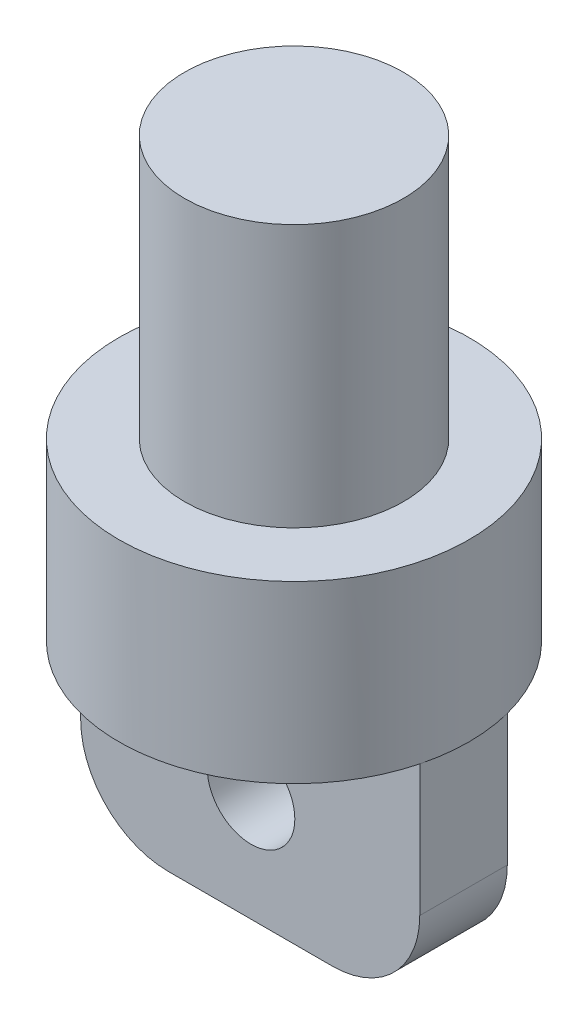
ISO-10303-21;
HEADER;
FILE_DESCRIPTION(('STEP AP214'),'2;1');
FILE_NAME('part.step','',(''),(''),'','','');
FILE_SCHEMA(('AUTOMOTIVE_DESIGN { 1 0 10303 214 1 1 1 1 }'));
ENDSEC;
DATA;
#1=APPLICATION_CONTEXT('core data for automotive mechanical design processes');
#2=APPLICATION_PROTOCOL_DEFINITION('international standard','automotive_design',2000,#1);
#3=PRODUCT_CONTEXT('',#1,'mechanical');
#4=PRODUCT('Part','Part','',(#3));
#5=PRODUCT_RELATED_PRODUCT_CATEGORY('part','',(#4));
#6=PRODUCT_DEFINITION_FORMATION('','',#4);
#7=PRODUCT_DEFINITION_CONTEXT('part definition',#1,'design');
#8=PRODUCT_DEFINITION('design','',#6,#7);
#9=PRODUCT_DEFINITION_SHAPE('','',#8);
#10=(LENGTH_UNIT() NAMED_UNIT(*) SI_UNIT(.MILLI.,.METRE.));
#11=(NAMED_UNIT(*) PLANE_ANGLE_UNIT() SI_UNIT($,.RADIAN.));
#12=(NAMED_UNIT(*) SI_UNIT($,.STERADIAN.) SOLID_ANGLE_UNIT());
#13=UNCERTAINTY_MEASURE_WITH_UNIT(LENGTH_MEASURE(1.E-05),#10,'distance_accuracy_value','');
#14=(GEOMETRIC_REPRESENTATION_CONTEXT(3) GLOBAL_UNCERTAINTY_ASSIGNED_CONTEXT((#13)) GLOBAL_UNIT_ASSIGNED_CONTEXT((#10,
#11,#12)) REPRESENTATION_CONTEXT('',''));
#15=CARTESIAN_POINT('',(0.,0.,0.));
#16=DIRECTION('',(0.,0.,1.));
#17=DIRECTION('',(1.,0.,0.));
#18=AXIS2_PLACEMENT_3D('',#15,#16,#17);
#19=CARTESIAN_POINT('',(0.,0.,0.));
#20=DIRECTION('',(0.,1.,0.));
#21=DIRECTION('',(0.,0.,1.));
#22=AXIS2_PLACEMENT_3D('',#19,#20,#21);
#23=PLANE('',#22);
#24=DIRECTION('',(0.,0.,1.));
#25=VECTOR('',#24,1.);
#26=CARTESIAN_POINT('',(49.1868884968342,0.,-12.7));
#27=LINE('',#26,#25);
#28=CARTESIAN_POINT('',(49.1868884968342,0.,-12.7));
#29=VERTEX_POINT('',#28);
#30=CARTESIAN_POINT('',(49.1868884968342,0.,12.7));
#31=VERTEX_POINT('',#30);
#32=EDGE_CURVE('E142',#29,#31,#27,.T.);
#33=ORIENTED_EDGE('',*,*,#32,.F.);
#34=CARTESIAN_POINT('',(0.,0.,0.));
#35=DIRECTION('',(0.,1.,0.));
#36=DIRECTION('',(0.,0.,1.));
#37=AXIS2_PLACEMENT_3D('',#34,#35,#36);
#38=CIRCLE('',#37,50.8);
#39=EDGE_CURVE('E135',#31,#29,#38,.T.);
#40=ORIENTED_EDGE('',*,*,#39,.F.);
#41=EDGE_LOOP('',(#33,#40));
#42=FACE_BOUND('',#41,.T.);
#43=ADVANCED_FACE('F47',(#42),#23,.F.);
#44=DIRECTION('',(1.,0.,0.));
#45=VECTOR('',#44,1.);
#46=CARTESIAN_POINT('',(-49.1868884968342,0.,-12.7));
#47=LINE('',#46,#45);
#48=CARTESIAN_POINT('',(-49.1868884968342,0.,-12.7000000000001));
#49=VERTEX_POINT('',#48);
#50=EDGE_CURVE('E138',#49,#29,#47,.T.);
#51=ORIENTED_EDGE('',*,*,#50,.F.);
#52=EDGE_CURVE('E125',#29,#49,#38,.T.);
#53=ORIENTED_EDGE('',*,*,#52,.F.);
#54=EDGE_LOOP('',(#51,#53));
#55=FACE_BOUND('',#54,.T.);
#56=ADVANCED_FACE('F223',(#55),#23,.F.);
#57=DIRECTION('',(0.,0.,-1.));
#58=VECTOR('',#57,1.);
#59=CARTESIAN_POINT('',(-49.1868884968342,0.,-12.7));
#60=LINE('',#59,#58);
#61=CARTESIAN_POINT('',(-49.1868884968342,0.,12.7));
#62=VERTEX_POINT('',#61);
#63=EDGE_CURVE('E104',#62,#49,#60,.T.);
#64=ORIENTED_EDGE('',*,*,#63,.F.);
#65=EDGE_CURVE('E118',#49,#62,#38,.T.);
#66=ORIENTED_EDGE('',*,*,#65,.F.);
#67=EDGE_LOOP('',(#64,#66));
#68=FACE_BOUND('',#67,.T.);
#69=ADVANCED_FACE('F136',(#68),#23,.F.);
#70=DIRECTION('',(-1.,0.,0.));
#71=VECTOR('',#70,1.);
#72=CARTESIAN_POINT('',(-49.1868884968342,0.,12.7));
#73=LINE('',#72,#71);
#74=EDGE_CURVE('E132',#31,#62,#73,.T.);
#75=ORIENTED_EDGE('',*,*,#74,.F.);
#76=EDGE_CURVE('E122',#62,#31,#38,.T.);
#77=ORIENTED_EDGE('',*,*,#76,.F.);
#78=EDGE_LOOP('',(#75,#77));
#79=FACE_BOUND('',#78,.T.);
#80=ADVANCED_FACE('F131',(#79),#23,.F.);
#81=CARTESIAN_POINT('',(0.,50.8,0.));
#82=DIRECTION('',(0.,-1.,0.));
#83=DIRECTION('',(0.,0.,-1.));
#84=AXIS2_PLACEMENT_3D('',#81,#82,#83);
#85=CYLINDRICAL_SURFACE('',#84,50.8);
#86=CARTESIAN_POINT('',(0.,50.8,0.));
#87=DIRECTION('',(0.,1.,0.));
#88=DIRECTION('',(0.,0.,1.));
#89=AXIS2_PLACEMENT_3D('',#86,#87,#88);
#90=CIRCLE('',#89,50.8);
#91=CARTESIAN_POINT('',(0.,50.8,50.8));
#92=VERTEX_POINT('',#91);
#93=EDGE_CURVE('E170',#92,#92,#90,.T.);
#94=ORIENTED_EDGE('',*,*,#93,.F.);
#95=EDGE_LOOP('',(#94));
#96=FACE_BOUND('',#95,.T.);
#97=ORIENTED_EDGE('',*,*,#39,.T.);
#98=ORIENTED_EDGE('',*,*,#52,.T.);
#99=ORIENTED_EDGE('',*,*,#65,.T.);
#100=ORIENTED_EDGE('',*,*,#76,.T.);
#101=EDGE_LOOP('',(#97,#98,#99,#100));
#102=FACE_BOUND('',#101,.T.);
#103=ADVANCED_FACE('F121',(#96,#102),#85,.T.);
#104=CARTESIAN_POINT('',(0.,50.8,0.));
#105=DIRECTION('',(0.,1.,0.));
#106=DIRECTION('',(0.,0.,1.));
#107=AXIS2_PLACEMENT_3D('',#104,#105,#106);
#108=PLANE('',#107);
#109=CARTESIAN_POINT('',(0.,50.8,0.));
#110=DIRECTION('',(0.,1.,0.));
#111=DIRECTION('',(0.,0.,1.));
#112=AXIS2_PLACEMENT_3D('',#109,#110,#111);
#113=CIRCLE('',#112,31.75);
#114=CARTESIAN_POINT('',(0.,50.8,-31.75));
#115=VERTEX_POINT('',#114);
#116=EDGE_CURVE('E165',#115,#115,#113,.T.);
#117=ORIENTED_EDGE('',*,*,#116,.F.);
#118=EDGE_LOOP('',(#117));
#119=FACE_BOUND('',#118,.T.);
#120=ORIENTED_EDGE('',*,*,#93,.T.);
#121=EDGE_LOOP('',(#120));
#122=FACE_BOUND('',#121,.T.);
#123=ADVANCED_FACE('F239',(#119,#122),#108,.T.);
#124=CARTESIAN_POINT('',(0.,127.,0.));
#125=DIRECTION('',(0.,-1.,0.));
#126=DIRECTION('',(0.,0.,-1.));
#127=AXIS2_PLACEMENT_3D('',#124,#125,#126);
#128=CYLINDRICAL_SURFACE('',#127,31.75);
#129=CARTESIAN_POINT('',(0.,127.,0.));
#130=DIRECTION('',(0.,1.,0.));
#131=DIRECTION('',(0.,0.,1.));
#132=AXIS2_PLACEMENT_3D('',#129,#130,#131);
#133=CIRCLE('',#132,31.75);
#134=CARTESIAN_POINT('',(0.,127.,-31.75));
#135=VERTEX_POINT('',#134);
#136=EDGE_CURVE('E134',#135,#135,#133,.T.);
#137=CARTESIAN_POINT('',(0.,127.,-31.75));
#138=CARTESIAN_POINT('',(0.,126.20625,-31.75));
#139=CARTESIAN_POINT('',(0.,125.4125,-31.75));
#140=CARTESIAN_POINT('',(0.,123.825,-31.75));
#141=CARTESIAN_POINT('',(0.,123.03125,-31.75));
#142=CARTESIAN_POINT('',(0.,121.44375,-31.75));
#143=CARTESIAN_POINT('',(0.,120.65,-31.75));
#144=CARTESIAN_POINT('',(0.,119.0625,-31.75));
#145=CARTESIAN_POINT('',(0.,118.26875,-31.75));
#146=CARTESIAN_POINT('',(0.,116.68125,-31.75));
#147=CARTESIAN_POINT('',(0.,115.8875,-31.75));
#148=CARTESIAN_POINT('',(0.,114.3,-31.75));
#149=CARTESIAN_POINT('',(0.,113.50625,-31.75));
#150=CARTESIAN_POINT('',(0.,111.91875,-31.75));
#151=CARTESIAN_POINT('',(0.,111.125,-31.75));
#152=CARTESIAN_POINT('',(0.,109.5375,-31.75));
#153=CARTESIAN_POINT('',(0.,108.74375,-31.75));
#154=CARTESIAN_POINT('',(0.,107.15625,-31.75));
#155=CARTESIAN_POINT('',(0.,106.3625,-31.75));
#156=CARTESIAN_POINT('',(0.,104.775,-31.75));
#157=CARTESIAN_POINT('',(0.,103.98125,-31.75));
#158=CARTESIAN_POINT('',(0.,102.39375,-31.75));
#159=CARTESIAN_POINT('',(0.,101.6,-31.75));
#160=CARTESIAN_POINT('',(0.,100.0125,-31.75));
#161=CARTESIAN_POINT('',(0.,99.21875,-31.75));
#162=CARTESIAN_POINT('',(0.,97.63125,-31.75));
#163=CARTESIAN_POINT('',(0.,96.8375,-31.75));
#164=CARTESIAN_POINT('',(0.,95.25,-31.75));
#165=CARTESIAN_POINT('',(0.,94.45625,-31.75));
#166=CARTESIAN_POINT('',(0.,92.86875,-31.75));
#167=CARTESIAN_POINT('',(0.,92.075,-31.75));
#168=CARTESIAN_POINT('',(0.,90.4875,-31.75));
#169=CARTESIAN_POINT('',(0.,89.69375,-31.75));
#170=CARTESIAN_POINT('',(0.,88.10625,-31.75));
#171=CARTESIAN_POINT('',(0.,87.3125,-31.75));
#172=CARTESIAN_POINT('',(0.,85.725,-31.75));
#173=CARTESIAN_POINT('',(0.,84.93125,-31.75));
#174=CARTESIAN_POINT('',(0.,83.34375,-31.75));
#175=CARTESIAN_POINT('',(0.,82.55,-31.75));
#176=CARTESIAN_POINT('',(0.,80.9625,-31.75));
#177=CARTESIAN_POINT('',(0.,80.16875,-31.75));
#178=CARTESIAN_POINT('',(0.,78.58125,-31.75));
#179=CARTESIAN_POINT('',(0.,77.7875,-31.75));
#180=CARTESIAN_POINT('',(0.,76.2,-31.75));
#181=CARTESIAN_POINT('',(0.,75.40625,-31.75));
#182=CARTESIAN_POINT('',(0.,73.81875,-31.75));
#183=CARTESIAN_POINT('',(0.,73.025,-31.75));
#184=CARTESIAN_POINT('',(0.,71.4375,-31.75));
#185=CARTESIAN_POINT('',(0.,70.64375,-31.75));
#186=CARTESIAN_POINT('',(0.,69.05625,-31.75));
#187=CARTESIAN_POINT('',(0.,68.2625,-31.75));
#188=CARTESIAN_POINT('',(0.,66.675,-31.75));
#189=CARTESIAN_POINT('',(0.,65.88125,-31.75));
#190=CARTESIAN_POINT('',(0.,64.29375,-31.75));
#191=CARTESIAN_POINT('',(0.,63.5,-31.75));
#192=CARTESIAN_POINT('',(0.,61.9125,-31.75));
#193=CARTESIAN_POINT('',(0.,61.11875,-31.75));
#194=CARTESIAN_POINT('',(0.,59.53125,-31.75));
#195=CARTESIAN_POINT('',(0.,58.7375,-31.75));
#196=CARTESIAN_POINT('',(0.,57.15,-31.75));
#197=CARTESIAN_POINT('',(0.,56.35625,-31.75));
#198=CARTESIAN_POINT('',(0.,54.76875,-31.75));
#199=CARTESIAN_POINT('',(0.,53.975,-31.75));
#200=CARTESIAN_POINT('',(0.,52.3875,-31.75));
#201=CARTESIAN_POINT('',(0.,51.59375,-31.75));
#202=CARTESIAN_POINT('',(0.,50.8,-31.75));
#203=B_SPLINE_CURVE_WITH_KNOTS('',3,(#137,#138,#139,#140,#141,#142,#143,#144,#145,#146,#147,
#148,#149,#150,#151,#152,#153,#154,#155,#156,#157,#158,#159,#160,#161,#162,#163,#164,#165,#166,
#167,#168,#169,#170,#171,#172,#173,#174,#175,#176,#177,#178,#179,#180,#181,#182,#183,#184,#185,
#186,#187,#188,#189,#190,#191,#192,#193,#194,#195,#196,#197,#198,#199,#200,#201,#202),
.UNSPECIFIED.,.F.,.F.,(4,2,2,2,2,2,2,2,2,2,2,2,2,2,2,2,2,2,2,2,2,2,2,2,2,2,2,2,2,2,2,2,4),(0.,
2.38124999999999,4.76249999999999,7.14374999999999,9.52499999999998,11.90625,14.2875,16.66875,
19.05,21.43125,23.8125,26.19375,28.575,30.95625,33.3375,35.71875,38.1,40.48125,42.8625,45.24375,
47.625,50.00625,52.3875,54.76875,57.15,59.53125,61.9125,64.29375,66.675,69.05625,71.4375,
73.81875,76.2),.UNSPECIFIED.);
#204=EDGE_CURVE('BSEAM331',#135,#115,#203,.T.);
#205=ORIENTED_EDGE('',*,*,#136,.F.);
#206=ORIENTED_EDGE('',*,*,#116,.T.);
#207=ORIENTED_EDGE('',*,*,#204,.T.);
#208=ORIENTED_EDGE('',*,*,#204,.F.);
#209=EDGE_LOOP('',(#205,#207,#206,#208));
#210=FACE_BOUND('',#209,.T.);
#211=ADVANCED_FACE('F331',(#210),#128,.T.);
#212=CARTESIAN_POINT('',(0.,127.,0.));
#213=DIRECTION('',(0.,1.,0.));
#214=DIRECTION('',(0.,0.,1.));
#215=AXIS2_PLACEMENT_3D('',#212,#213,#214);
#216=PLANE('',#215);
#217=ORIENTED_EDGE('',*,*,#136,.T.);
#218=EDGE_LOOP('',(#217));
#219=FACE_BOUND('',#218,.T.);
#220=ADVANCED_FACE('F220',(#219),#216,.T.);
#221=CARTESIAN_POINT('',(49.1868884968342,-63.5,-12.7));
#222=DIRECTION('',(-1.,0.,0.));
#223=DIRECTION('',(0.,0.,1.));
#224=AXIS2_PLACEMENT_3D('',#221,#222,#223);
#225=PLANE('',#224);
#226=DIRECTION('',(0.,1.,0.));
#227=VECTOR('',#226,1.);
#228=CARTESIAN_POINT('',(49.1868884968342,-63.5,12.7));
#229=LINE('',#228,#227);
#230=CARTESIAN_POINT('',(49.1868884968342,-38.1,12.7));
#231=VERTEX_POINT('',#230);
#232=EDGE_CURVE('E111',#231,#31,#229,.T.);
#233=ORIENTED_EDGE('',*,*,#232,.F.);
#234=DIRECTION('',(0.,0.,1.));
#235=VECTOR('',#234,1.);
#236=CARTESIAN_POINT('',(49.1868884968342,-38.1,-12.7));
#237=LINE('',#236,#235);
#238=CARTESIAN_POINT('',(49.1868884968342,-38.1,-12.7));
#239=VERTEX_POINT('',#238);
#240=EDGE_CURVE('E56',#231,#239,#237,.F.);
#241=ORIENTED_EDGE('',*,*,#240,.T.);
#242=DIRECTION('',(0.,1.,0.));
#243=VECTOR('',#242,1.);
#244=CARTESIAN_POINT('',(49.1868884968342,-63.5,-12.7));
#245=LINE('',#244,#243);
#246=EDGE_CURVE('E154',#239,#29,#245,.T.);
#247=ORIENTED_EDGE('',*,*,#246,.T.);
#248=ORIENTED_EDGE('',*,*,#32,.T.);
#249=EDGE_LOOP('',(#233,#241,#247,#248));
#250=FACE_BOUND('',#249,.T.);
#251=ADVANCED_FACE('F211',(#250),#225,.F.);
#252=CARTESIAN_POINT('',(-49.1868884968342,-63.5,12.7));
#253=DIRECTION('',(0.,0.,-1.));
#254=DIRECTION('',(-1.,0.,0.));
#255=AXIS2_PLACEMENT_3D('',#252,#253,#254);
#256=PLANE('',#255);
#257=CARTESIAN_POINT('',(0.243990195886043,-31.9670642886024,12.7));
#258=DIRECTION('',(0.,0.,1.));
#259=DIRECTION('',(1.,0.,0.));
#260=AXIS2_PLACEMENT_3D('',#257,#258,#259);
#261=CIRCLE('',#260,12.7);
#262=CARTESIAN_POINT('',(12.943990195886,-31.9670642886024,12.7));
#263=VERTEX_POINT('',#262);
#264=EDGE_CURVE('E178',#263,#263,#261,.T.);
#265=ORIENTED_EDGE('',*,*,#264,.F.);
#266=EDGE_LOOP('',(#265));
#267=FACE_BOUND('',#266,.T.);
#268=DIRECTION('',(-1.,0.,0.));
#269=VECTOR('',#268,1.);
#270=CARTESIAN_POINT('',(-49.1868884968342,-63.5,12.7));
#271=LINE('',#270,#269);
#272=CARTESIAN_POINT('',(23.7868884968342,-63.5,12.7));
#273=VERTEX_POINT('',#272);
#274=CARTESIAN_POINT('',(-23.7868884968342,-63.5,12.7));
#275=VERTEX_POINT('',#274);
#276=EDGE_CURVE('E153',#273,#275,#271,.T.);
#277=ORIENTED_EDGE('',*,*,#276,.F.);
#278=CARTESIAN_POINT('',(23.7868884968342,-38.1,12.7));
#279=DIRECTION('',(0.,0.,-1.));
#280=DIRECTION('',(-1.,0.,0.));
#281=AXIS2_PLACEMENT_3D('',#278,#279,#280);
#282=CIRCLE('',#281,25.4);
#283=EDGE_CURVE('E70',#273,#231,#282,.F.);
#284=ORIENTED_EDGE('',*,*,#283,.T.);
#285=ORIENTED_EDGE('',*,*,#232,.T.);
#286=ORIENTED_EDGE('',*,*,#74,.T.);
#287=DIRECTION('',(0.,1.,0.));
#288=VECTOR('',#287,1.);
#289=CARTESIAN_POINT('',(-49.1868884968342,-63.5,12.7));
#290=LINE('',#289,#288);
#291=CARTESIAN_POINT('',(-49.1868884968342,-38.1,12.7));
#292=VERTEX_POINT('',#291);
#293=EDGE_CURVE('E99',#292,#62,#290,.T.);
#294=ORIENTED_EDGE('',*,*,#293,.F.);
#295=CARTESIAN_POINT('',(-23.7868884968342,-38.1,12.7));
#296=DIRECTION('',(0.,0.,-1.));
#297=DIRECTION('',(-1.,0.,0.));
#298=AXIS2_PLACEMENT_3D('',#295,#296,#297);
#299=CIRCLE('',#298,25.4);
#300=EDGE_CURVE('E187',#292,#275,#299,.F.);
#301=ORIENTED_EDGE('',*,*,#300,.T.);
#302=EDGE_LOOP('',(#277,#284,#285,#286,#294,#301));
#303=FACE_BOUND('',#302,.T.);
#304=ADVANCED_FACE('F140',(#267,#303),#256,.F.);
#305=CARTESIAN_POINT('',(-49.1868884968342,-63.5,-12.7));
#306=DIRECTION('',(1.,0.,0.));
#307=DIRECTION('',(0.,0.,-1.));
#308=AXIS2_PLACEMENT_3D('',#305,#306,#307);
#309=PLANE('',#308);
#310=DIRECTION('',(0.,1.,0.));
#311=VECTOR('',#310,1.);
#312=CARTESIAN_POINT('',(-49.1868884968342,-63.5,-12.7));
#313=LINE('',#312,#311);
#314=CARTESIAN_POINT('',(-49.1868884968342,-38.1,-12.7));
#315=VERTEX_POINT('',#314);
#316=EDGE_CURVE('E112',#315,#49,#313,.T.);
#317=ORIENTED_EDGE('',*,*,#316,.F.);
#318=DIRECTION('',(0.,0.,-1.));
#319=VECTOR('',#318,1.);
#320=CARTESIAN_POINT('',(-49.1868884968342,-38.1,-12.7));
#321=LINE('',#320,#319);
#322=EDGE_CURVE('E106',#315,#292,#321,.F.);
#323=ORIENTED_EDGE('',*,*,#322,.T.);
#324=ORIENTED_EDGE('',*,*,#293,.T.);
#325=ORIENTED_EDGE('',*,*,#63,.T.);
#326=EDGE_LOOP('',(#317,#323,#324,#325));
#327=FACE_BOUND('',#326,.T.);
#328=ADVANCED_FACE('F102',(#327),#309,.F.);
#329=CARTESIAN_POINT('',(-49.1868884968342,-63.5,-12.7));
#330=DIRECTION('',(0.,0.,1.));
#331=DIRECTION('',(1.,0.,0.));
#332=AXIS2_PLACEMENT_3D('',#329,#330,#331);
#333=PLANE('',#332);
#334=CARTESIAN_POINT('',(0.243990195886043,-31.9670642886024,-12.7));
#335=DIRECTION('',(0.,0.,1.));
#336=DIRECTION('',(1.,0.,0.));
#337=AXIS2_PLACEMENT_3D('',#334,#335,#336);
#338=CIRCLE('',#337,12.7);
#339=CARTESIAN_POINT('',(12.943990195886,-31.9670642886024,-12.7));
#340=VERTEX_POINT('',#339);
#341=EDGE_CURVE('E146',#340,#340,#338,.T.);
#342=ORIENTED_EDGE('',*,*,#341,.T.);
#343=EDGE_LOOP('',(#342));
#344=FACE_BOUND('',#343,.T.);
#345=ORIENTED_EDGE('',*,*,#246,.F.);
#346=CARTESIAN_POINT('',(23.7868884968342,-38.1,-12.7));
#347=DIRECTION('',(0.,0.,1.));
#348=DIRECTION('',(1.,0.,0.));
#349=AXIS2_PLACEMENT_3D('',#346,#347,#348);
#350=CIRCLE('',#349,25.4);
#351=CARTESIAN_POINT('',(23.7868884968342,-63.5,-12.7));
#352=VERTEX_POINT('',#351);
#353=EDGE_CURVE('E11',#239,#352,#350,.F.);
#354=ORIENTED_EDGE('',*,*,#353,.T.);
#355=DIRECTION('',(1.,0.,0.));
#356=VECTOR('',#355,1.);
#357=CARTESIAN_POINT('',(-49.1868884968342,-63.5,-12.7));
#358=LINE('',#357,#356);
#359=CARTESIAN_POINT('',(-23.7868884968342,-63.5,-12.7));
#360=VERTEX_POINT('',#359);
#361=EDGE_CURVE('E157',#360,#352,#358,.T.);
#362=ORIENTED_EDGE('',*,*,#361,.F.);
#363=CARTESIAN_POINT('',(-23.7868884968342,-38.1,-12.7));
#364=DIRECTION('',(0.,0.,1.));
#365=DIRECTION('',(1.,0.,0.));
#366=AXIS2_PLACEMENT_3D('',#363,#364,#365);
#367=CIRCLE('',#366,25.4);
#368=EDGE_CURVE('E182',#360,#315,#367,.F.);
#369=ORIENTED_EDGE('',*,*,#368,.T.);
#370=ORIENTED_EDGE('',*,*,#316,.T.);
#371=ORIENTED_EDGE('',*,*,#50,.T.);
#372=EDGE_LOOP('',(#345,#354,#362,#369,#370,#371));
#373=FACE_BOUND('',#372,.T.);
#374=ADVANCED_FACE('F218',(#344,#373),#333,.F.);
#375=CARTESIAN_POINT('',(0.,-63.5,0.));
#376=DIRECTION('',(0.,1.,0.));
#377=DIRECTION('',(0.,0.,1.));
#378=AXIS2_PLACEMENT_3D('',#375,#376,#377);
#379=PLANE('',#378);
#380=ORIENTED_EDGE('',*,*,#361,.T.);
#381=DIRECTION('',(0.,0.,1.));
#382=VECTOR('',#381,1.);
#383=CARTESIAN_POINT('',(23.7868884968342,-63.5,0.));
#384=LINE('',#383,#382);
#385=EDGE_CURVE('E190',#352,#273,#384,.T.);
#386=ORIENTED_EDGE('',*,*,#385,.T.);
#387=ORIENTED_EDGE('',*,*,#276,.T.);
#388=DIRECTION('',(0.,0.,-1.));
#389=VECTOR('',#388,1.);
#390=CARTESIAN_POINT('',(-23.7868884968342,-63.5,0.));
#391=LINE('',#390,#389);
#392=EDGE_CURVE('E169',#275,#360,#391,.T.);
#393=ORIENTED_EDGE('',*,*,#392,.T.);
#394=EDGE_LOOP('',(#380,#386,#387,#393));
#395=FACE_BOUND('',#394,.T.);
#396=ADVANCED_FACE('F273',(#395),#379,.F.);
#397=CARTESIAN_POINT('',(0.243990195886043,-31.9670642886024,-50.8));
#398=DIRECTION('',(0.,0.,1.));
#399=DIRECTION('',(1.,0.,0.));
#400=AXIS2_PLACEMENT_3D('',#397,#398,#399);
#401=CYLINDRICAL_SURFACE('',#400,12.7);
#402=ORIENTED_EDGE('',*,*,#264,.T.);
#403=EDGE_LOOP('',(#402));
#404=FACE_BOUND('',#403,.T.);
#405=ORIENTED_EDGE('',*,*,#341,.F.);
#406=EDGE_LOOP('',(#405));
#407=FACE_BOUND('',#406,.T.);
#408=ADVANCED_FACE('F207',(#404,#407),#401,.F.);
#409=CARTESIAN_POINT('',(-23.7868884968342,-38.1,0.));
#410=DIRECTION('',(0.,0.,-1.));
#411=DIRECTION('',(-1.,0.,0.));
#412=AXIS2_PLACEMENT_3D('',#409,#410,#411);
#413=CYLINDRICAL_SURFACE('',#412,25.4);
#414=ORIENTED_EDGE('',*,*,#300,.F.);
#415=ORIENTED_EDGE('',*,*,#322,.F.);
#416=ORIENTED_EDGE('',*,*,#368,.F.);
#417=ORIENTED_EDGE('',*,*,#392,.F.);
#418=EDGE_LOOP('',(#414,#415,#416,#417));
#419=FACE_BOUND('',#418,.T.);
#420=ADVANCED_FACE('F289',(#419),#413,.T.);
#421=CARTESIAN_POINT('',(23.7868884968342,-38.1,0.));
#422=DIRECTION('',(0.,0.,1.));
#423=DIRECTION('',(1.,0.,0.));
#424=AXIS2_PLACEMENT_3D('',#421,#422,#423);
#425=CYLINDRICAL_SURFACE('',#424,25.4);
#426=ORIENTED_EDGE('',*,*,#353,.F.);
#427=ORIENTED_EDGE('',*,*,#240,.F.);
#428=ORIENTED_EDGE('',*,*,#283,.F.);
#429=ORIENTED_EDGE('',*,*,#385,.F.);
#430=EDGE_LOOP('',(#426,#427,#428,#429));
#431=FACE_BOUND('',#430,.T.);
#432=ADVANCED_FACE('F49',(#431),#425,.T.);
#433=CLOSED_SHELL('',(#43,#56,#69,#80,#103,#123,#211,#220,#251,#304,#328,#374,#396,#408,#420,#432));
#434=MANIFOLD_SOLID_BREP('B2',#433);
#435=ADVANCED_BREP_SHAPE_REPRESENTATION('',(#18,#434),#14);
#436=SHAPE_DEFINITION_REPRESENTATION(#9,#435);
ENDSEC;
END-ISO-10303-21;
